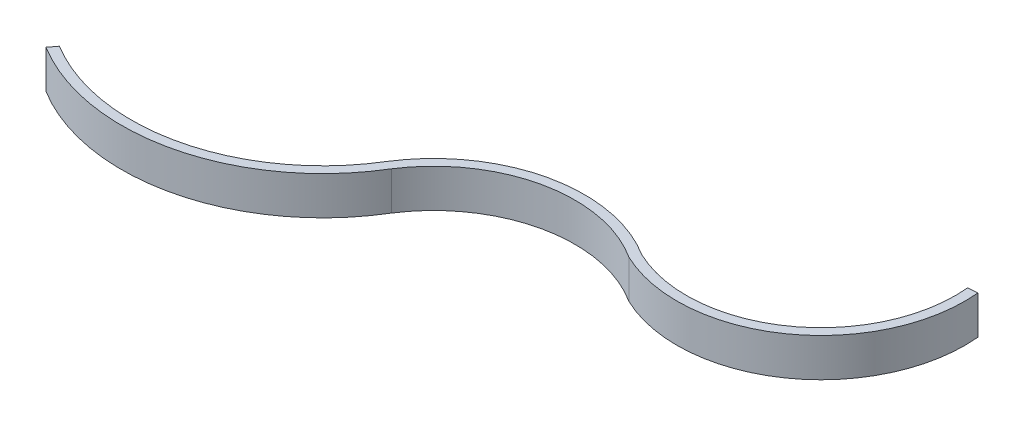
ISO-10303-21;
HEADER;
FILE_DESCRIPTION(('STEP AP214'),'2;1');
FILE_NAME('part.step','',(''),(''),'','','');
FILE_SCHEMA(('AUTOMOTIVE_DESIGN { 1 0 10303 214 1 1 1 1 }'));
ENDSEC;
DATA;
#1=APPLICATION_CONTEXT('core data for automotive mechanical design processes');
#2=APPLICATION_PROTOCOL_DEFINITION('international standard','automotive_design',2000,#1);
#3=PRODUCT_CONTEXT('',#1,'mechanical');
#4=PRODUCT('Part','Part','',(#3));
#5=PRODUCT_RELATED_PRODUCT_CATEGORY('part','',(#4));
#6=PRODUCT_DEFINITION_FORMATION('','',#4);
#7=PRODUCT_DEFINITION_CONTEXT('part definition',#1,'design');
#8=PRODUCT_DEFINITION('design','',#6,#7);
#9=PRODUCT_DEFINITION_SHAPE('','',#8);
#10=(LENGTH_UNIT() NAMED_UNIT(*) SI_UNIT(.MILLI.,.METRE.));
#11=(NAMED_UNIT(*) PLANE_ANGLE_UNIT() SI_UNIT($,.RADIAN.));
#12=(NAMED_UNIT(*) SI_UNIT($,.STERADIAN.) SOLID_ANGLE_UNIT());
#13=UNCERTAINTY_MEASURE_WITH_UNIT(LENGTH_MEASURE(1.E-05),#10,'distance_accuracy_value','');
#14=(GEOMETRIC_REPRESENTATION_CONTEXT(3) GLOBAL_UNCERTAINTY_ASSIGNED_CONTEXT((#13)) GLOBAL_UNIT_ASSIGNED_CONTEXT((#10,
#11,#12)) REPRESENTATION_CONTEXT('',''));
#15=CARTESIAN_POINT('',(0.,0.,0.));
#16=DIRECTION('',(0.,0.,1.));
#17=DIRECTION('',(1.,0.,0.));
#18=AXIS2_PLACEMENT_3D('',#15,#16,#17);
#19=CARTESIAN_POINT('',(-698.376926892793,200.,65.9618631385946));
#20=DIRECTION('',(0.,-1.,0.));
#21=DIRECTION('',(0.,0.,-1.));
#22=AXIS2_PLACEMENT_3D('',#19,#20,#21);
#23=CYLINDRICAL_SURFACE('',#22,701.48506712897);
#24=CARTESIAN_POINT('',(-698.376926892793,0.,65.9618631385946));
#25=DIRECTION('',(0.,-1.,0.));
#26=DIRECTION('',(0.,0.,1.));
#27=AXIS2_PLACEMENT_3D('',#24,#25,#26);
#28=CIRCLE('',#27,701.48506712897);
#29=CARTESIAN_POINT('',(0.,0.,0.));
#30=VERTEX_POINT('',#29);
#31=CARTESIAN_POINT('',(-1000.,0.,699.290230712873));
#32=VERTEX_POINT('',#31);
#33=EDGE_CURVE('E129',#30,#32,#28,.T.);
#34=ORIENTED_EDGE('',*,*,#33,.T.);
#35=DIRECTION('',(0.,-1.,0.));
#36=VECTOR('',#35,1.);
#37=CARTESIAN_POINT('',(-1000.,200.,699.290230712873));
#38=LINE('',#37,#36);
#39=CARTESIAN_POINT('',(-1000.,200.,699.290230712873));
#40=VERTEX_POINT('',#39);
#41=EDGE_CURVE('E11',#40,#32,#38,.T.);
#42=ORIENTED_EDGE('',*,*,#41,.F.);
#43=CARTESIAN_POINT('',(-698.376926892793,200.,65.9618631385946));
#44=DIRECTION('',(0.,-1.,0.));
#45=DIRECTION('',(0.,0.,1.));
#46=AXIS2_PLACEMENT_3D('',#43,#44,#45);
#47=CIRCLE('',#46,701.48506712897);
#48=CARTESIAN_POINT('',(0.,200.,0.));
#49=VERTEX_POINT('',#48);
#50=EDGE_CURVE('E143',#49,#40,#47,.T.);
#51=ORIENTED_EDGE('',*,*,#50,.F.);
#52=DIRECTION('',(0.,-1.,0.));
#53=VECTOR('',#52,1.);
#54=CARTESIAN_POINT('',(0.,200.,0.));
#55=LINE('',#54,#53);
#56=EDGE_CURVE('E125',#49,#30,#55,.T.);
#57=ORIENTED_EDGE('',*,*,#56,.T.);
#58=EDGE_LOOP('',(#34,#42,#51,#57));
#59=FACE_BOUND('',#58,.T.);
#60=ADVANCED_FACE('F33',(#59),#23,.F.);
#61=CARTESIAN_POINT('',(-1420.76872917547,200.,1363.62712131528));
#62=DIRECTION('',(0.,-1.,0.));
#63=DIRECTION('',(0.,0.,-1.));
#64=AXIS2_PLACEMENT_3D('',#61,#62,#63);
#65=CYLINDRICAL_SURFACE('',#64,786.377662238199);
#66=CARTESIAN_POINT('',(-1420.76872917547,0.,1363.62712131528));
#67=DIRECTION('',(0.,1.,0.));
#68=DIRECTION('',(0.,0.,1.));
#69=AXIS2_PLACEMENT_3D('',#66,#67,#68);
#70=CIRCLE('',#69,786.377662238199);
#71=CARTESIAN_POINT('',(-2085.10561977787,0.,942.858392139796));
#72=VERTEX_POINT('',#71);
#73=EDGE_CURVE('E132',#32,#72,#70,.T.);
#74=ORIENTED_EDGE('',*,*,#73,.T.);
#75=DIRECTION('',(0.,-1.,0.));
#76=VECTOR('',#75,1.);
#77=CARTESIAN_POINT('',(-2085.10561977787,200.,942.858392139796));
#78=LINE('',#77,#76);
#79=CARTESIAN_POINT('',(-2085.10561977787,200.,942.858392139796));
#80=VERTEX_POINT('',#79);
#81=EDGE_CURVE('E41',#80,#72,#78,.T.);
#82=ORIENTED_EDGE('',*,*,#81,.F.);
#83=CARTESIAN_POINT('',(-1420.76872917547,200.,1363.62712131528));
#84=DIRECTION('',(0.,1.,0.));
#85=DIRECTION('',(0.,0.,1.));
#86=AXIS2_PLACEMENT_3D('',#83,#84,#85);
#87=CIRCLE('',#86,786.377662238199);
#88=EDGE_CURVE('E92',#40,#80,#87,.T.);
#89=ORIENTED_EDGE('',*,*,#88,.F.);
#90=ORIENTED_EDGE('',*,*,#41,.T.);
#91=EDGE_LOOP('',(#74,#82,#89,#90));
#92=FACE_BOUND('',#91,.T.);
#93=ADVANCED_FACE('F178',(#92),#65,.T.);
#94=CARTESIAN_POINT('',(-2939.0113320991,200.,422.43065031085));
#95=DIRECTION('',(0.,-1.,0.));
#96=DIRECTION('',(0.,0.,-1.));
#97=AXIS2_PLACEMENT_3D('',#94,#95,#96);
#98=CYLINDRICAL_SURFACE('',#97,1000.);
#99=CARTESIAN_POINT('',(-2939.0113320991,0.,422.43065031085));
#100=DIRECTION('',(0.,-1.,0.));
#101=DIRECTION('',(0.,0.,-1.));
#102=AXIS2_PLACEMENT_3D('',#99,#100,#101);
#103=CIRCLE('',#102,1000.);
#104=CARTESIAN_POINT('',(-3459.439073928,0.,1276.33636263211));
#105=VERTEX_POINT('',#104);
#106=EDGE_CURVE('E134',#72,#105,#103,.T.);
#107=ORIENTED_EDGE('',*,*,#106,.T.);
#108=DIRECTION('',(0.,-1.,0.));
#109=VECTOR('',#108,1.);
#110=CARTESIAN_POINT('',(-3459.439073928,200.,1276.33636263211));
#111=LINE('',#110,#109);
#112=CARTESIAN_POINT('',(-3459.439073928,200.,1276.33636263211));
#113=VERTEX_POINT('',#112);
#114=EDGE_CURVE('E150',#113,#105,#111,.T.);
#115=ORIENTED_EDGE('',*,*,#114,.F.);
#116=CARTESIAN_POINT('',(-2939.0113320991,200.,422.43065031085));
#117=DIRECTION('',(0.,-1.,0.));
#118=DIRECTION('',(0.,0.,-1.));
#119=AXIS2_PLACEMENT_3D('',#116,#117,#118);
#120=CIRCLE('',#119,1000.);
#121=EDGE_CURVE('E158',#80,#113,#120,.T.);
#122=ORIENTED_EDGE('',*,*,#121,.F.);
#123=ORIENTED_EDGE('',*,*,#81,.T.);
#124=EDGE_LOOP('',(#107,#115,#122,#123));
#125=FACE_BOUND('',#124,.T.);
#126=ADVANCED_FACE('F156',(#125),#98,.F.);
#127=CARTESIAN_POINT('',(-3459.439073928,200.,1276.33636263211));
#128=DIRECTION('',(0.795941374552645,0.,0.605373709600315));
#129=DIRECTION('',(0.605373709600315,0.,-0.795941374552645));
#130=AXIS2_PLACEMENT_3D('',#127,#128,#129);
#131=PLANE('',#130);
#132=DIRECTION('',(-0.605373709600315,0.,0.795941374552645));
#133=VECTOR('',#132,1.);
#134=CARTESIAN_POINT('',(-3459.439073928,0.,1276.33636263211));
#135=LINE('',#134,#133);
#136=CARTESIAN_POINT('',(-3489.70775940802,0.,1316.13343135974));
#137=VERTEX_POINT('',#136);
#138=EDGE_CURVE('E136',#105,#137,#135,.T.);
#139=ORIENTED_EDGE('',*,*,#138,.T.);
#140=DIRECTION('',(0.,-1.,0.));
#141=VECTOR('',#140,1.);
#142=CARTESIAN_POINT('',(-3489.70775940802,200.,1316.13343135974));
#143=LINE('',#142,#141);
#144=CARTESIAN_POINT('',(-3489.70775940802,200.,1316.13343135974));
#145=VERTEX_POINT('',#144);
#146=EDGE_CURVE('E147',#145,#137,#143,.T.);
#147=ORIENTED_EDGE('',*,*,#146,.F.);
#148=DIRECTION('',(-0.605373709600315,0.,0.795941374552645));
#149=VECTOR('',#148,1.);
#150=CARTESIAN_POINT('',(-3459.439073928,200.,1276.33636263211));
#151=LINE('',#150,#149);
#152=EDGE_CURVE('E170',#113,#145,#151,.T.);
#153=ORIENTED_EDGE('',*,*,#152,.F.);
#154=ORIENTED_EDGE('',*,*,#114,.T.);
#155=EDGE_LOOP('',(#139,#147,#153,#154));
#156=FACE_BOUND('',#155,.T.);
#157=ADVANCED_FACE('F166',(#156),#131,.F.);
#158=CARTESIAN_POINT('',(-2939.0113320991,200.,422.43065031085));
#159=DIRECTION('',(0.,-1.,0.));
#160=DIRECTION('',(0.,0.,-1.));
#161=AXIS2_PLACEMENT_3D('',#158,#159,#160);
#162=CYLINDRICAL_SURFACE('',#161,1049.74816785042);
#163=CARTESIAN_POINT('',(-2939.0113320991,0.,422.43065031085));
#164=DIRECTION('',(0.,1.,0.));
#165=DIRECTION('',(0.,0.,-1.));
#166=AXIS2_PLACEMENT_3D('',#163,#164,#165);
#167=CIRCLE('',#166,1049.74816785042);
#168=CARTESIAN_POINT('',(-2039.96364903241,0.,964.357286930363));
#169=VERTEX_POINT('',#168);
#170=EDGE_CURVE('E138',#137,#169,#167,.T.);
#171=ORIENTED_EDGE('',*,*,#170,.T.);
#172=DIRECTION('',(0.,-1.,0.));
#173=VECTOR('',#172,1.);
#174=CARTESIAN_POINT('',(-2039.96364903241,200.,964.357286930363));
#175=LINE('',#174,#173);
#176=CARTESIAN_POINT('',(-2039.96364903241,200.,964.357286930363));
#177=VERTEX_POINT('',#176);
#178=EDGE_CURVE('E120',#177,#169,#175,.T.);
#179=ORIENTED_EDGE('',*,*,#178,.F.);
#180=CARTESIAN_POINT('',(-2939.0113320991,200.,422.43065031085));
#181=DIRECTION('',(0.,1.,0.));
#182=DIRECTION('',(0.,0.,-1.));
#183=AXIS2_PLACEMENT_3D('',#180,#181,#182);
#184=CIRCLE('',#183,1049.74816785042);
#185=EDGE_CURVE('E111',#145,#177,#184,.T.);
#186=ORIENTED_EDGE('',*,*,#185,.F.);
#187=ORIENTED_EDGE('',*,*,#146,.T.);
#188=EDGE_LOOP('',(#171,#179,#186,#187));
#189=FACE_BOUND('',#188,.T.);
#190=ADVANCED_FACE('F169',(#189),#162,.T.);
#191=CARTESIAN_POINT('',(-1420.76872917547,200.,1363.62712131528));
#192=DIRECTION('',(0.,-1.,0.));
#193=DIRECTION('',(0.,0.,-1.));
#194=AXIS2_PLACEMENT_3D('',#191,#192,#193);
#195=CYLINDRICAL_SURFACE('',#194,736.762342568075);
#196=CARTESIAN_POINT('',(-1420.76872917547,0.,1363.62712131528));
#197=DIRECTION('',(0.,-1.,0.));
#198=DIRECTION('',(0.,0.,1.));
#199=AXIS2_PLACEMENT_3D('',#196,#197,#198);
#200=CIRCLE('',#199,736.762342568075);
#201=CARTESIAN_POINT('',(-1021.49889479057,0.,744.432201458334));
#202=VERTEX_POINT('',#201);
#203=EDGE_CURVE('E119',#169,#202,#200,.T.);
#204=ORIENTED_EDGE('',*,*,#203,.T.);
#205=DIRECTION('',(0.,-1.,0.));
#206=VECTOR('',#205,1.);
#207=CARTESIAN_POINT('',(-1021.49889479057,200.,744.432201458334));
#208=LINE('',#207,#206);
#209=CARTESIAN_POINT('',(-1021.49889479057,200.,744.432201458334));
#210=VERTEX_POINT('',#209);
#211=EDGE_CURVE('E116',#210,#202,#208,.T.);
#212=ORIENTED_EDGE('',*,*,#211,.F.);
#213=CARTESIAN_POINT('',(-1420.76872917547,200.,1363.62712131528));
#214=DIRECTION('',(0.,-1.,0.));
#215=DIRECTION('',(0.,0.,1.));
#216=AXIS2_PLACEMENT_3D('',#213,#214,#215);
#217=CIRCLE('',#216,736.762342568075);
#218=EDGE_CURVE('E105',#177,#210,#217,.T.);
#219=ORIENTED_EDGE('',*,*,#218,.F.);
#220=ORIENTED_EDGE('',*,*,#178,.T.);
#221=EDGE_LOOP('',(#204,#212,#219,#220));
#222=FACE_BOUND('',#221,.T.);
#223=ADVANCED_FACE('F117',(#222),#195,.F.);
#224=CARTESIAN_POINT('',(-698.376926892793,200.,65.9618631385945));
#225=DIRECTION('',(0.,-1.,0.));
#226=DIRECTION('',(0.,0.,-1.));
#227=AXIS2_PLACEMENT_3D('',#224,#225,#226);
#228=CYLINDRICAL_SURFACE('',#227,751.48506712897);
#229=CARTESIAN_POINT('',(-698.376926892793,0.,65.9618631385945));
#230=DIRECTION('',(0.,1.,0.));
#231=DIRECTION('',(0.,0.,-1.));
#232=AXIS2_PLACEMENT_3D('',#229,#230,#231);
#233=CIRCLE('',#232,751.48506712897);
#234=CARTESIAN_POINT('',(49.7784599856916,0.,-4.70158712063269));
#235=VERTEX_POINT('',#234);
#236=EDGE_CURVE('E78',#202,#235,#233,.T.);
#237=ORIENTED_EDGE('',*,*,#236,.T.);
#238=DIRECTION('',(0.,-1.,0.));
#239=VECTOR('',#238,1.);
#240=CARTESIAN_POINT('',(49.7784599856916,200.,-4.70158712063269));
#241=LINE('',#240,#239);
#242=CARTESIAN_POINT('',(49.7784599856916,200.,-4.70158712063269));
#243=VERTEX_POINT('',#242);
#244=EDGE_CURVE('E121',#243,#235,#241,.T.);
#245=ORIENTED_EDGE('',*,*,#244,.F.);
#246=CARTESIAN_POINT('',(-698.376926892793,200.,65.9618631385945));
#247=DIRECTION('',(0.,1.,0.));
#248=DIRECTION('',(0.,0.,-1.));
#249=AXIS2_PLACEMENT_3D('',#246,#247,#248);
#250=CIRCLE('',#249,751.48506712897);
#251=EDGE_CURVE('E109',#210,#243,#250,.T.);
#252=ORIENTED_EDGE('',*,*,#251,.F.);
#253=ORIENTED_EDGE('',*,*,#211,.T.);
#254=EDGE_LOOP('',(#237,#245,#252,#253));
#255=FACE_BOUND('',#254,.T.);
#256=ADVANCED_FACE('F123',(#255),#228,.T.);
#257=CARTESIAN_POINT('',(49.7784599856916,200.,-4.70158712063269));
#258=DIRECTION('',(0.0940317424126538,0.,0.995569199713832));
#259=DIRECTION('',(0.995569199713832,0.,-0.0940317424126538));
#260=AXIS2_PLACEMENT_3D('',#257,#258,#259);
#261=PLANE('',#260);
#262=DIRECTION('',(-0.995569199713832,0.,0.0940317424126538));
#263=VECTOR('',#262,1.);
#264=CARTESIAN_POINT('',(49.7784599856916,0.,-4.70158712063269));
#265=LINE('',#264,#263);
#266=EDGE_CURVE('E84',#235,#30,#265,.T.);
#267=ORIENTED_EDGE('',*,*,#266,.T.);
#268=ORIENTED_EDGE('',*,*,#56,.F.);
#269=DIRECTION('',(-0.995569199713832,0.,0.0940317424126538));
#270=VECTOR('',#269,1.);
#271=CARTESIAN_POINT('',(49.7784599856916,200.,-4.70158712063269));
#272=LINE('',#271,#270);
#273=EDGE_CURVE('E49',#243,#49,#272,.T.);
#274=ORIENTED_EDGE('',*,*,#273,.F.);
#275=ORIENTED_EDGE('',*,*,#244,.T.);
#276=EDGE_LOOP('',(#267,#268,#274,#275));
#277=FACE_BOUND('',#276,.T.);
#278=ADVANCED_FACE('F194',(#277),#261,.F.);
#279=CARTESIAN_POINT('',(-698.376926892793,200.,65.9618631385946));
#280=DIRECTION('',(0.,1.,0.));
#281=DIRECTION('',(0.,0.,1.));
#282=AXIS2_PLACEMENT_3D('',#279,#280,#281);
#283=PLANE('',#282);
#284=ORIENTED_EDGE('',*,*,#50,.T.);
#285=ORIENTED_EDGE('',*,*,#88,.T.);
#286=ORIENTED_EDGE('',*,*,#121,.T.);
#287=ORIENTED_EDGE('',*,*,#152,.T.);
#288=ORIENTED_EDGE('',*,*,#185,.T.);
#289=ORIENTED_EDGE('',*,*,#218,.T.);
#290=ORIENTED_EDGE('',*,*,#251,.T.);
#291=ORIENTED_EDGE('',*,*,#273,.T.);
#292=EDGE_LOOP('',(#284,#285,#286,#287,#288,#289,#290,#291));
#293=FACE_BOUND('',#292,.T.);
#294=ADVANCED_FACE('F107',(#293),#283,.T.);
#295=CARTESIAN_POINT('',(-698.376926892793,0.,65.9618631385946));
#296=DIRECTION('',(0.,1.,0.));
#297=DIRECTION('',(0.,0.,1.));
#298=AXIS2_PLACEMENT_3D('',#295,#296,#297);
#299=PLANE('',#298);
#300=ORIENTED_EDGE('',*,*,#33,.F.);
#301=ORIENTED_EDGE('',*,*,#266,.F.);
#302=ORIENTED_EDGE('',*,*,#236,.F.);
#303=ORIENTED_EDGE('',*,*,#203,.F.);
#304=ORIENTED_EDGE('',*,*,#170,.F.);
#305=ORIENTED_EDGE('',*,*,#138,.F.);
#306=ORIENTED_EDGE('',*,*,#106,.F.);
#307=ORIENTED_EDGE('',*,*,#73,.F.);
#308=EDGE_LOOP('',(#300,#301,#302,#303,#304,#305,#306,#307));
#309=FACE_BOUND('',#308,.T.);
#310=ADVANCED_FACE('F162',(#309),#299,.F.);
#311=CLOSED_SHELL('',(#60,#93,#126,#157,#190,#223,#256,#278,#294,#310));
#312=MANIFOLD_SOLID_BREP('B2',#311);
#313=ADVANCED_BREP_SHAPE_REPRESENTATION('',(#18,#312),#14);
#314=SHAPE_DEFINITION_REPRESENTATION(#9,#313);
ENDSEC;
END-ISO-10303-21;
